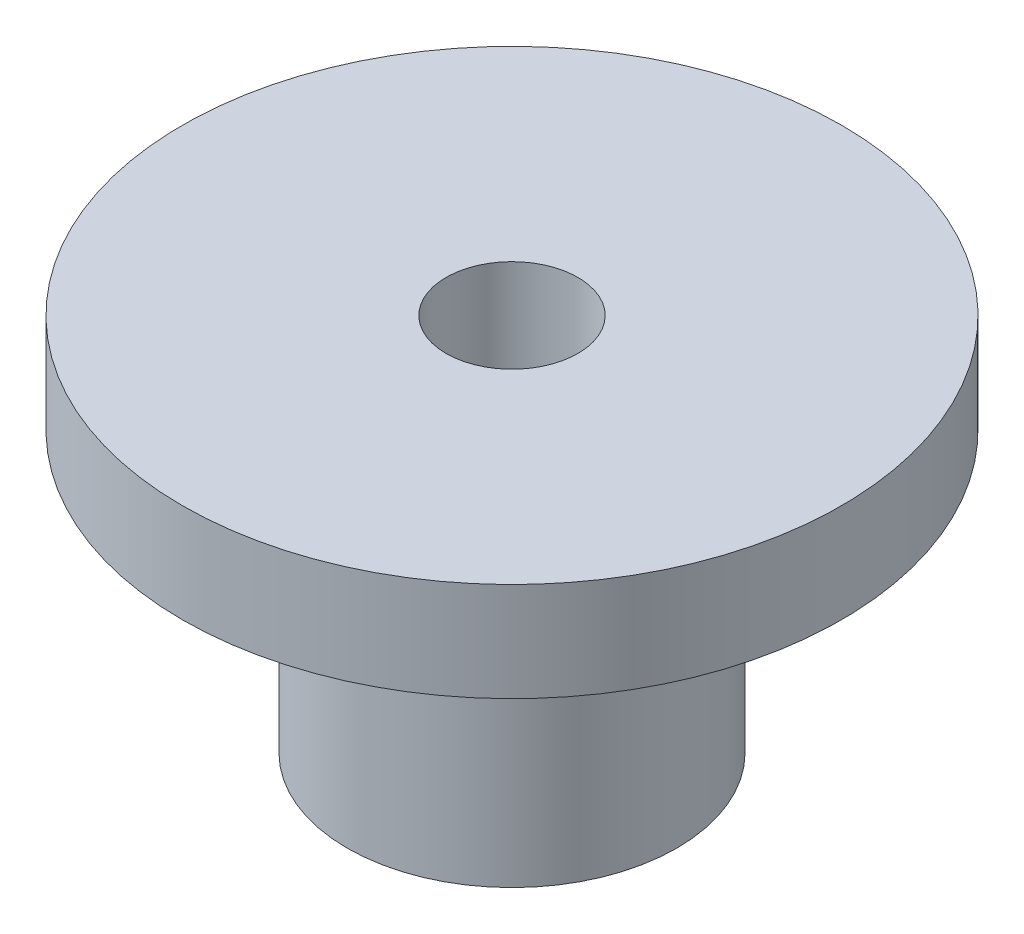
ISO-10303-21;
HEADER;
FILE_DESCRIPTION(('STEP AP214'),'2;1');
FILE_NAME('part.step','',(''),(''),'','','');
FILE_SCHEMA(('AUTOMOTIVE_DESIGN { 1 0 10303 214 1 1 1 1 }'));
ENDSEC;
DATA;
#1=APPLICATION_CONTEXT('core data for automotive mechanical design processes');
#2=APPLICATION_PROTOCOL_DEFINITION('international standard','automotive_design',2000,#1);
#3=PRODUCT_CONTEXT('',#1,'mechanical');
#4=PRODUCT('Part','Part','',(#3));
#5=PRODUCT_RELATED_PRODUCT_CATEGORY('part','',(#4));
#6=PRODUCT_DEFINITION_FORMATION('','',#4);
#7=PRODUCT_DEFINITION_CONTEXT('part definition',#1,'design');
#8=PRODUCT_DEFINITION('design','',#6,#7);
#9=PRODUCT_DEFINITION_SHAPE('','',#8);
#10=(LENGTH_UNIT() NAMED_UNIT(*) SI_UNIT(.MILLI.,.METRE.));
#11=(NAMED_UNIT(*) PLANE_ANGLE_UNIT() SI_UNIT($,.RADIAN.));
#12=(NAMED_UNIT(*) SI_UNIT($,.STERADIAN.) SOLID_ANGLE_UNIT());
#13=UNCERTAINTY_MEASURE_WITH_UNIT(LENGTH_MEASURE(1.E-05),#10,'distance_accuracy_value','');
#14=(GEOMETRIC_REPRESENTATION_CONTEXT(3) GLOBAL_UNCERTAINTY_ASSIGNED_CONTEXT((#13)) GLOBAL_UNIT_ASSIGNED_CONTEXT((#10,
#11,#12)) REPRESENTATION_CONTEXT('',''));
#15=CARTESIAN_POINT('',(0.,0.,0.));
#16=DIRECTION('',(0.,0.,1.));
#17=DIRECTION('',(1.,0.,0.));
#18=AXIS2_PLACEMENT_3D('',#15,#16,#17);
#19=CARTESIAN_POINT('',(0.,0.,0.));
#20=DIRECTION('',(0.,1.,0.));
#21=DIRECTION('',(0.,0.,1.));
#22=AXIS2_PLACEMENT_3D('',#19,#20,#21);
#23=PLANE('',#22);
#24=CARTESIAN_POINT('',(0.,0.,0.));
#25=DIRECTION('',(0.,1.,0.));
#26=DIRECTION('',(0.,0.,1.));
#27=AXIS2_PLACEMENT_3D('',#24,#25,#26);
#28=CIRCLE('',#27,5.);
#29=CARTESIAN_POINT('',(0.,0.,5.));
#30=VERTEX_POINT('',#29);
#31=EDGE_CURVE('E41',#30,#30,#28,.T.);
#32=ORIENTED_EDGE('',*,*,#31,.F.);
#33=EDGE_LOOP('',(#32));
#34=FACE_BOUND('',#33,.T.);
#35=CARTESIAN_POINT('',(0.,0.,0.));
#36=DIRECTION('',(0.,1.,0.));
#37=DIRECTION('',(0.,0.,1.));
#38=AXIS2_PLACEMENT_3D('',#35,#36,#37);
#39=CIRCLE('',#38,2.);
#40=CARTESIAN_POINT('',(0.,0.,2.));
#41=VERTEX_POINT('',#40);
#42=EDGE_CURVE('E50',#41,#41,#39,.T.);
#43=ORIENTED_EDGE('',*,*,#42,.T.);
#44=EDGE_LOOP('',(#43));
#45=FACE_BOUND('',#44,.T.);
#46=ADVANCED_FACE('F37',(#34,#45),#23,.F.);
#47=CARTESIAN_POINT('',(0.,8.5,0.));
#48=DIRECTION('',(0.,-1.,0.));
#49=DIRECTION('',(0.,0.,-1.));
#50=AXIS2_PLACEMENT_3D('',#47,#48,#49);
#51=CYLINDRICAL_SURFACE('',#50,5.);
#52=CARTESIAN_POINT('',(0.,8.5,0.));
#53=DIRECTION('',(0.,1.,0.));
#54=DIRECTION('',(0.,0.,1.));
#55=AXIS2_PLACEMENT_3D('',#52,#53,#54);
#56=CIRCLE('',#55,5.);
#57=CARTESIAN_POINT('',(0.,8.5,5.));
#58=VERTEX_POINT('',#57);
#59=EDGE_CURVE('E10',#58,#58,#56,.T.);
#60=ORIENTED_EDGE('',*,*,#59,.F.);
#61=EDGE_LOOP('',(#60));
#62=FACE_BOUND('',#61,.T.);
#63=ORIENTED_EDGE('',*,*,#31,.T.);
#64=EDGE_LOOP('',(#63));
#65=FACE_BOUND('',#64,.T.);
#66=ADVANCED_FACE('F39',(#62,#65),#51,.T.);
#67=CARTESIAN_POINT('',(0.,8.5,0.));
#68=DIRECTION('',(0.,-1.,0.));
#69=DIRECTION('',(0.,0.,-1.));
#70=AXIS2_PLACEMENT_3D('',#67,#68,#69);
#71=CYLINDRICAL_SURFACE('',#70,2.);
#72=ORIENTED_EDGE('',*,*,#42,.F.);
#73=EDGE_LOOP('',(#72));
#74=FACE_BOUND('',#73,.T.);
#75=CARTESIAN_POINT('',(0.,11.5,0.));
#76=DIRECTION('',(0.,1.,0.));
#77=DIRECTION('',(0.,0.,1.));
#78=AXIS2_PLACEMENT_3D('',#75,#76,#77);
#79=CIRCLE('',#78,2.);
#80=CARTESIAN_POINT('',(0.,11.5,2.));
#81=VERTEX_POINT('',#80);
#82=EDGE_CURVE('E60',#81,#81,#79,.T.);
#83=ORIENTED_EDGE('',*,*,#82,.T.);
#84=EDGE_LOOP('',(#83));
#85=FACE_BOUND('',#84,.T.);
#86=ADVANCED_FACE('F68',(#74,#85),#71,.F.);
#87=CARTESIAN_POINT('',(0.,11.5,0.));
#88=DIRECTION('',(0.,1.,0.));
#89=DIRECTION('',(0.,0.,1.));
#90=AXIS2_PLACEMENT_3D('',#87,#88,#89);
#91=PLANE('',#90);
#92=CARTESIAN_POINT('',(0.,11.5,0.));
#93=DIRECTION('',(0.,1.,0.));
#94=DIRECTION('',(0.,0.,1.));
#95=AXIS2_PLACEMENT_3D('',#92,#93,#94);
#96=CIRCLE('',#95,10.);
#97=CARTESIAN_POINT('',(0.,11.5,10.));
#98=VERTEX_POINT('',#97);
#99=EDGE_CURVE('E55',#98,#98,#96,.T.);
#100=ORIENTED_EDGE('',*,*,#99,.T.);
#101=EDGE_LOOP('',(#100));
#102=FACE_BOUND('',#101,.T.);
#103=ORIENTED_EDGE('',*,*,#82,.F.);
#104=EDGE_LOOP('',(#103));
#105=FACE_BOUND('',#104,.T.);
#106=ADVANCED_FACE('F70',(#102,#105),#91,.T.);
#107=CARTESIAN_POINT('',(0.,8.5,0.));
#108=DIRECTION('',(0.,1.,0.));
#109=DIRECTION('',(0.,0.,1.));
#110=AXIS2_PLACEMENT_3D('',#107,#108,#109);
#111=PLANE('',#110);
#112=ORIENTED_EDGE('',*,*,#59,.T.);
#113=EDGE_LOOP('',(#112));
#114=FACE_BOUND('',#113,.T.);
#115=CARTESIAN_POINT('',(0.,8.5,0.));
#116=DIRECTION('',(0.,1.,0.));
#117=DIRECTION('',(0.,0.,1.));
#118=AXIS2_PLACEMENT_3D('',#115,#116,#117);
#119=CIRCLE('',#118,10.);
#120=CARTESIAN_POINT('',(0.,8.5,10.));
#121=VERTEX_POINT('',#120);
#122=EDGE_CURVE('E56',#121,#121,#119,.T.);
#123=ORIENTED_EDGE('',*,*,#122,.F.);
#124=EDGE_LOOP('',(#123));
#125=FACE_BOUND('',#124,.T.);
#126=ADVANCED_FACE('F72',(#114,#125),#111,.F.);
#127=CARTESIAN_POINT('',(0.,11.5,0.));
#128=DIRECTION('',(0.,-1.,0.));
#129=DIRECTION('',(0.,0.,-1.));
#130=AXIS2_PLACEMENT_3D('',#127,#128,#129);
#131=CYLINDRICAL_SURFACE('',#130,10.);
#132=ORIENTED_EDGE('',*,*,#99,.F.);
#133=EDGE_LOOP('',(#132));
#134=FACE_BOUND('',#133,.T.);
#135=ORIENTED_EDGE('',*,*,#122,.T.);
#136=EDGE_LOOP('',(#135));
#137=FACE_BOUND('',#136,.T.);
#138=ADVANCED_FACE('F79',(#134,#137),#131,.T.);
#139=CLOSED_SHELL('',(#46,#66,#86,#106,#126,#138));
#140=MANIFOLD_SOLID_BREP('B2',#139);
#141=ADVANCED_BREP_SHAPE_REPRESENTATION('',(#18,#140),#14);
#142=SHAPE_DEFINITION_REPRESENTATION(#9,#141);
ENDSEC;
END-ISO-10303-21;
